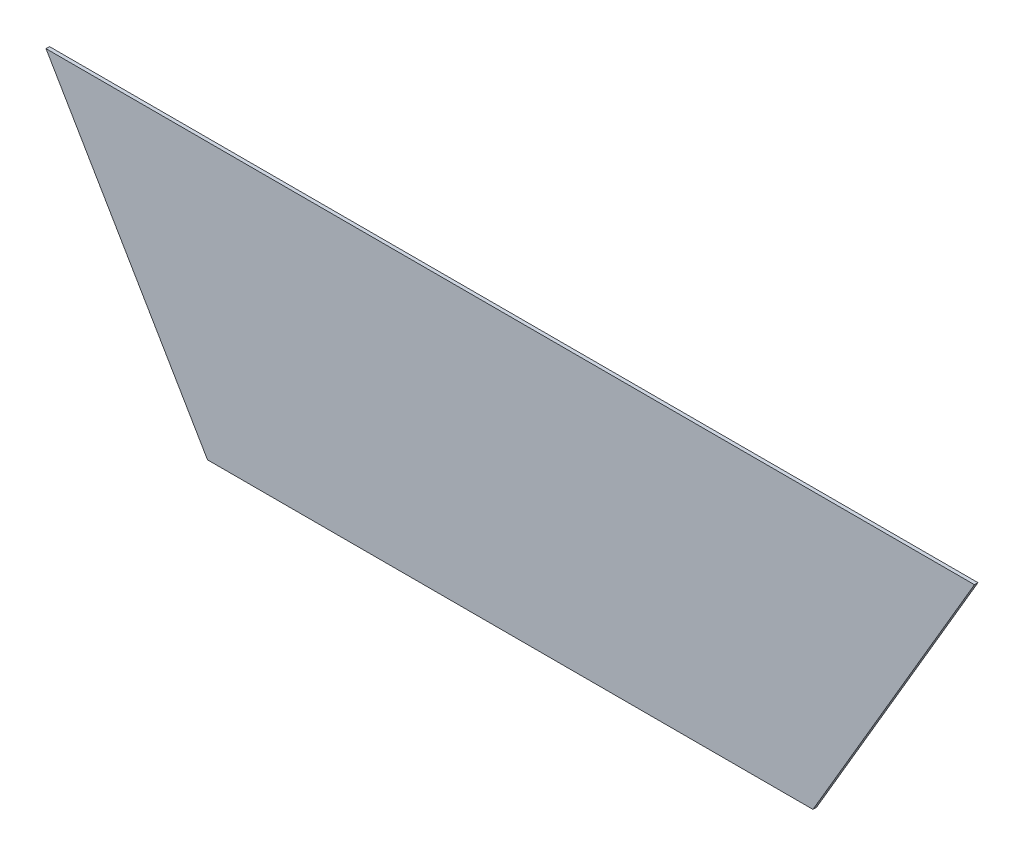
ISO-10303-21;
HEADER;
FILE_DESCRIPTION(('STEP AP214'),'2;1');
FILE_NAME('part.step','',(''),(''),'','','');
FILE_SCHEMA(('AUTOMOTIVE_DESIGN { 1 0 10303 214 1 1 1 1 }'));
ENDSEC;
DATA;
#1=APPLICATION_CONTEXT('core data for automotive mechanical design processes');
#2=APPLICATION_PROTOCOL_DEFINITION('international standard','automotive_design',2000,#1);
#3=PRODUCT_CONTEXT('',#1,'mechanical');
#4=PRODUCT('Part','Part','',(#3));
#5=PRODUCT_RELATED_PRODUCT_CATEGORY('part','',(#4));
#6=PRODUCT_DEFINITION_FORMATION('','',#4);
#7=PRODUCT_DEFINITION_CONTEXT('part definition',#1,'design');
#8=PRODUCT_DEFINITION('design','',#6,#7);
#9=PRODUCT_DEFINITION_SHAPE('','',#8);
#10=(LENGTH_UNIT() NAMED_UNIT(*) SI_UNIT(.MILLI.,.METRE.));
#11=(NAMED_UNIT(*) PLANE_ANGLE_UNIT() SI_UNIT($,.RADIAN.));
#12=(NAMED_UNIT(*) SI_UNIT($,.STERADIAN.) SOLID_ANGLE_UNIT());
#13=UNCERTAINTY_MEASURE_WITH_UNIT(LENGTH_MEASURE(1.E-05),#10,'distance_accuracy_value','');
#14=(GEOMETRIC_REPRESENTATION_CONTEXT(3) GLOBAL_UNCERTAINTY_ASSIGNED_CONTEXT((#13)) GLOBAL_UNIT_ASSIGNED_CONTEXT((#10,
#11,#12)) REPRESENTATION_CONTEXT('',''));
#15=CARTESIAN_POINT('',(0.,0.,0.));
#16=DIRECTION('',(0.,0.,1.));
#17=DIRECTION('',(1.,0.,0.));
#18=AXIS2_PLACEMENT_3D('',#15,#16,#17);
#19=CARTESIAN_POINT('',(-263.000000000005,155.999999999992,9.94302519225131));
#20=DIRECTION('',(0.,-1.,0.));
#21=DIRECTION('',(1.,0.,0.));
#22=AXIS2_PLACEMENT_3D('',#19,#20,#21);
#23=PLANE('',#22);
#24=DIRECTION('',(1.,0.,0.));
#25=VECTOR('',#24,1.);
#26=CARTESIAN_POINT('',(-263.000000000005,155.999999999992,11.9430251922513));
#27=LINE('',#26,#25);
#28=CARTESIAN_POINT('',(-263.000000000005,155.999999999992,11.9430251922513));
#29=VERTEX_POINT('',#28);
#30=CARTESIAN_POINT('',(262.999999999995,156.000000000008,11.9430251922499));
#31=VERTEX_POINT('',#30);
#32=EDGE_CURVE('E102',#29,#31,#27,.T.);
#33=ORIENTED_EDGE('',*,*,#32,.T.);
#34=DIRECTION('',(0.,0.,1.));
#35=VECTOR('',#34,1.);
#36=CARTESIAN_POINT('',(262.999999999995,156.000000000008,9.94302519224993));
#37=LINE('',#36,#35);
#38=CARTESIAN_POINT('',(262.999999999995,156.000000000008,9.94302519224993));
#39=VERTEX_POINT('',#38);
#40=EDGE_CURVE('E11',#39,#31,#37,.T.);
#41=ORIENTED_EDGE('',*,*,#40,.F.);
#42=DIRECTION('',(1.,0.,0.));
#43=VECTOR('',#42,1.);
#44=CARTESIAN_POINT('',(-263.000000000005,155.999999999992,9.94302519225131));
#45=LINE('',#44,#43);
#46=CARTESIAN_POINT('',(-263.000000000005,155.999999999992,9.94302519225131));
#47=VERTEX_POINT('',#46);
#48=EDGE_CURVE('E90',#47,#39,#45,.T.);
#49=ORIENTED_EDGE('',*,*,#48,.F.);
#50=DIRECTION('',(0.,0.,1.));
#51=VECTOR('',#50,1.);
#52=CARTESIAN_POINT('',(-263.000000000005,155.999999999992,9.94302519225131));
#53=LINE('',#52,#51);
#54=EDGE_CURVE('E98',#47,#29,#53,.T.);
#55=ORIENTED_EDGE('',*,*,#54,.T.);
#56=EDGE_LOOP('',(#33,#41,#49,#55));
#57=FACE_BOUND('',#56,.T.);
#58=ADVANCED_FACE('F39',(#57),#23,.F.);
#59=CARTESIAN_POINT('',(262.999999999995,156.000000000008,9.94302519224993));
#60=DIRECTION('',(-0.862573167257456,0.505932338487511,0.));
#61=DIRECTION('',(-0.505932338487511,-0.862573167257456,0.));
#62=AXIS2_PLACEMENT_3D('',#59,#60,#61);
#63=PLANE('',#62);
#64=DIRECTION('',(-0.505932338487511,-0.862573167257455,0.));
#65=VECTOR('',#64,1.);
#66=CARTESIAN_POINT('',(262.999999999995,156.000000000008,11.9430251922499));
#67=LINE('',#66,#65);
#68=CARTESIAN_POINT('',(171.5,5.18725908334101E-12,11.9430251922492));
#69=VERTEX_POINT('',#68);
#70=EDGE_CURVE('E94',#31,#69,#67,.T.);
#71=ORIENTED_EDGE('',*,*,#70,.T.);
#72=DIRECTION('',(0.,0.,1.));
#73=VECTOR('',#72,1.);
#74=CARTESIAN_POINT('',(171.5,5.19980460351927E-12,9.94302519224919));
#75=LINE('',#74,#73);
#76=CARTESIAN_POINT('',(171.5,5.19980460351927E-12,9.94302519224919));
#77=VERTEX_POINT('',#76);
#78=EDGE_CURVE('E47',#77,#69,#75,.T.);
#79=ORIENTED_EDGE('',*,*,#78,.F.);
#80=DIRECTION('',(-0.505932338487511,-0.862573167257455,0.));
#81=VECTOR('',#80,1.);
#82=CARTESIAN_POINT('',(262.999999999995,156.000000000008,9.94302519224993));
#83=LINE('',#82,#81);
#84=EDGE_CURVE('E85',#39,#77,#83,.T.);
#85=ORIENTED_EDGE('',*,*,#84,.F.);
#86=ORIENTED_EDGE('',*,*,#40,.T.);
#87=EDGE_LOOP('',(#71,#79,#85,#86));
#88=FACE_BOUND('',#87,.T.);
#89=ADVANCED_FACE('F93',(#88),#63,.F.);
#90=CARTESIAN_POINT('',(171.5,5.19980460351927E-12,9.94302519224919));
#91=DIRECTION('',(0.,1.,0.));
#92=DIRECTION('',(-1.,0.,0.));
#93=AXIS2_PLACEMENT_3D('',#90,#91,#92);
#94=PLANE('',#93);
#95=DIRECTION('',(-1.,0.,0.));
#96=VECTOR('',#95,1.);
#97=CARTESIAN_POINT('',(171.5,5.18725908334101E-12,11.9430251922492));
#98=LINE('',#97,#96);
#99=CARTESIAN_POINT('',(-171.5,-5.27389824986708E-12,11.9430251922501));
#100=VERTEX_POINT('',#99);
#101=EDGE_CURVE('E72',#69,#100,#98,.T.);
#102=ORIENTED_EDGE('',*,*,#101,.T.);
#103=DIRECTION('',(0.,0.,1.));
#104=VECTOR('',#103,1.);
#105=CARTESIAN_POINT('',(-171.5,-5.26135272968881E-12,9.94302519225009));
#106=LINE('',#105,#104);
#107=CARTESIAN_POINT('',(-171.5,-5.26135272968881E-12,9.94302519225009));
#108=VERTEX_POINT('',#107);
#109=EDGE_CURVE('E95',#108,#100,#106,.T.);
#110=ORIENTED_EDGE('',*,*,#109,.F.);
#111=DIRECTION('',(-1.,0.,0.));
#112=VECTOR('',#111,1.);
#113=CARTESIAN_POINT('',(171.5,5.19980460351927E-12,9.94302519224919));
#114=LINE('',#113,#112);
#115=EDGE_CURVE('E88',#77,#108,#114,.T.);
#116=ORIENTED_EDGE('',*,*,#115,.F.);
#117=ORIENTED_EDGE('',*,*,#78,.T.);
#118=EDGE_LOOP('',(#102,#110,#116,#117));
#119=FACE_BOUND('',#118,.T.);
#120=ADVANCED_FACE('F96',(#119),#94,.F.);
#121=CARTESIAN_POINT('',(-171.5,-5.26135272968881E-12,9.94302519225009));
#122=DIRECTION('',(0.862573167257425,0.505932338487563,0.));
#123=DIRECTION('',(-0.505932338487563,0.862573167257425,0.));
#124=AXIS2_PLACEMENT_3D('',#121,#122,#123);
#125=PLANE('',#124);
#126=DIRECTION('',(-0.505932338487563,0.862573167257425,0.));
#127=VECTOR('',#126,1.);
#128=CARTESIAN_POINT('',(-171.5,-5.27389824986708E-12,11.9430251922501));
#129=LINE('',#128,#127);
#130=EDGE_CURVE('E78',#100,#29,#129,.T.);
#131=ORIENTED_EDGE('',*,*,#130,.T.);
#132=ORIENTED_EDGE('',*,*,#54,.F.);
#133=DIRECTION('',(-0.505932338487563,0.862573167257425,0.));
#134=VECTOR('',#133,1.);
#135=CARTESIAN_POINT('',(-171.5,-5.26135272968881E-12,9.94302519225009));
#136=LINE('',#135,#134);
#137=EDGE_CURVE('E55',#108,#47,#136,.T.);
#138=ORIENTED_EDGE('',*,*,#137,.F.);
#139=ORIENTED_EDGE('',*,*,#109,.T.);
#140=EDGE_LOOP('',(#131,#132,#138,#139));
#141=FACE_BOUND('',#140,.T.);
#142=ADVANCED_FACE('F109',(#141),#125,.F.);
#143=CARTESIAN_POINT('',(0.,0.,9.94302519224964));
#144=DIRECTION('',(0.,0.,-1.));
#145=DIRECTION('',(0.,1.,0.));
#146=AXIS2_PLACEMENT_3D('',#143,#144,#145);
#147=PLANE('',#146);
#148=ORIENTED_EDGE('',*,*,#48,.T.);
#149=ORIENTED_EDGE('',*,*,#84,.T.);
#150=ORIENTED_EDGE('',*,*,#115,.T.);
#151=ORIENTED_EDGE('',*,*,#137,.T.);
#152=EDGE_LOOP('',(#148,#149,#150,#151));
#153=FACE_BOUND('',#152,.T.);
#154=ADVANCED_FACE('F86',(#153),#147,.T.);
#155=CARTESIAN_POINT('',(0.,0.,11.9430251922496));
#156=DIRECTION('',(0.,0.,-1.));
#157=DIRECTION('',(0.,1.,0.));
#158=AXIS2_PLACEMENT_3D('',#155,#156,#157);
#159=PLANE('',#158);
#160=ORIENTED_EDGE('',*,*,#32,.F.);
#161=ORIENTED_EDGE('',*,*,#130,.F.);
#162=ORIENTED_EDGE('',*,*,#101,.F.);
#163=ORIENTED_EDGE('',*,*,#70,.F.);
#164=EDGE_LOOP('',(#160,#161,#162,#163));
#165=FACE_BOUND('',#164,.T.);
#166=ADVANCED_FACE('F112',(#165),#159,.F.);
#167=CLOSED_SHELL('',(#58,#89,#120,#142,#154,#166));
#168=MANIFOLD_SOLID_BREP('B2',#167);
#169=ADVANCED_BREP_SHAPE_REPRESENTATION('',(#18,#168),#14);
#170=SHAPE_DEFINITION_REPRESENTATION(#9,#169);
ENDSEC;
END-ISO-10303-21;
